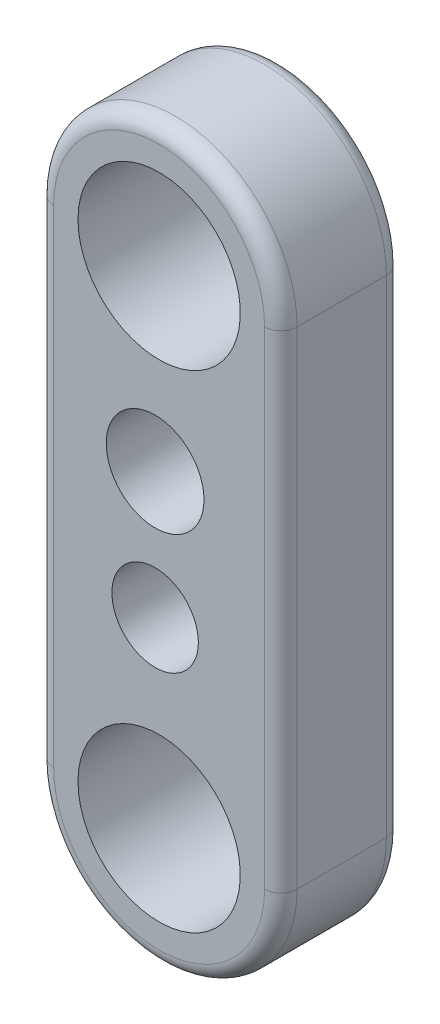
ISO-10303-21;
HEADER;
FILE_DESCRIPTION(('STEP AP214'),'2;1');
FILE_NAME('part.step','',(''),(''),'','','');
FILE_SCHEMA(('AUTOMOTIVE_DESIGN { 1 0 10303 214 1 1 1 1 }'));
ENDSEC;
DATA;
#1=APPLICATION_CONTEXT('core data for automotive mechanical design processes');
#2=APPLICATION_PROTOCOL_DEFINITION('international standard','automotive_design',2000,#1);
#3=PRODUCT_CONTEXT('',#1,'mechanical');
#4=PRODUCT('Part','Part','',(#3));
#5=PRODUCT_RELATED_PRODUCT_CATEGORY('part','',(#4));
#6=PRODUCT_DEFINITION_FORMATION('','',#4);
#7=PRODUCT_DEFINITION_CONTEXT('part definition',#1,'design');
#8=PRODUCT_DEFINITION('design','',#6,#7);
#9=PRODUCT_DEFINITION_SHAPE('','',#8);
#10=(LENGTH_UNIT() NAMED_UNIT(*) SI_UNIT(.MILLI.,.METRE.));
#11=(NAMED_UNIT(*) PLANE_ANGLE_UNIT() SI_UNIT($,.RADIAN.));
#12=(NAMED_UNIT(*) SI_UNIT($,.STERADIAN.) SOLID_ANGLE_UNIT());
#13=UNCERTAINTY_MEASURE_WITH_UNIT(LENGTH_MEASURE(1.E-05),#10,'distance_accuracy_value','');
#14=(GEOMETRIC_REPRESENTATION_CONTEXT(3) GLOBAL_UNCERTAINTY_ASSIGNED_CONTEXT((#13)) GLOBAL_UNIT_ASSIGNED_CONTEXT((#10,
#11,#12)) REPRESENTATION_CONTEXT('',''));
#15=CARTESIAN_POINT('',(0.,0.,0.));
#16=DIRECTION('',(0.,0.,1.));
#17=DIRECTION('',(1.,0.,0.));
#18=AXIS2_PLACEMENT_3D('',#15,#16,#17);
#19=CARTESIAN_POINT('',(-29.739928057554,28.1638489208633,19.05));
#20=DIRECTION('',(1.,0.,0.));
#21=DIRECTION('',(0.,0.,-1.));
#22=AXIS2_PLACEMENT_3D('',#19,#20,#21);
#23=PLANE('',#22);
#24=DIRECTION('',(0.,0.,-1.));
#25=VECTOR('',#24,1.);
#26=CARTESIAN_POINT('',(-29.739928057554,28.1638489208633,19.05));
#27=LINE('',#26,#25);
#28=CARTESIAN_POINT('',(-29.739928057554,28.1638489208633,16.51));
#29=VERTEX_POINT('',#28);
#30=CARTESIAN_POINT('',(-29.739928057554,28.1638489208633,2.54000000000001));
#31=VERTEX_POINT('',#30);
#32=EDGE_CURVE('E217',#29,#31,#27,.T.);
#33=ORIENTED_EDGE('',*,*,#32,.T.);
#34=DIRECTION('',(0.,-1.,0.));
#35=VECTOR('',#34,1.);
#36=CARTESIAN_POINT('',(-29.739928057554,28.1638489208633,2.54));
#37=LINE('',#36,#35);
#38=CARTESIAN_POINT('',(-29.739928057554,-48.0361510791367,2.54000000000001));
#39=VERTEX_POINT('',#38);
#40=EDGE_CURVE('E164',#31,#39,#37,.T.);
#41=ORIENTED_EDGE('',*,*,#40,.T.);
#42=DIRECTION('',(0.,0.,-1.));
#43=VECTOR('',#42,1.);
#44=CARTESIAN_POINT('',(-29.739928057554,-48.0361510791367,19.05));
#45=LINE('',#44,#43);
#46=CARTESIAN_POINT('',(-29.739928057554,-48.0361510791367,16.51));
#47=VERTEX_POINT('',#46);
#48=EDGE_CURVE('E149',#47,#39,#45,.T.);
#49=ORIENTED_EDGE('',*,*,#48,.F.);
#50=DIRECTION('',(0.,-1.,0.));
#51=VECTOR('',#50,1.);
#52=CARTESIAN_POINT('',(-29.739928057554,28.1638489208633,16.51));
#53=LINE('',#52,#51);
#54=EDGE_CURVE('E159',#47,#29,#53,.F.);
#55=ORIENTED_EDGE('',*,*,#54,.T.);
#56=EDGE_LOOP('',(#33,#41,#49,#55));
#57=FACE_BOUND('',#56,.T.);
#58=ADVANCED_FACE('F54',(#57),#23,.F.);
#59=CARTESIAN_POINT('',(-10.689928057554,-48.0361510791367,19.05));
#60=DIRECTION('',(0.,0.,-1.));
#61=DIRECTION('',(-1.,0.,0.));
#62=AXIS2_PLACEMENT_3D('',#59,#60,#61);
#63=CYLINDRICAL_SURFACE('',#62,19.05);
#64=ORIENTED_EDGE('',*,*,#48,.T.);
#65=CARTESIAN_POINT('',(-10.689928057554,-48.0361510791367,2.54));
#66=DIRECTION('',(0.,0.,1.));
#67=DIRECTION('',(1.,0.,0.));
#68=AXIS2_PLACEMENT_3D('',#65,#66,#67);
#69=CIRCLE('',#68,19.05);
#70=CARTESIAN_POINT('',(8.36007194244603,-48.0361510791367,2.54000000000001));
#71=VERTEX_POINT('',#70);
#72=EDGE_CURVE('E12',#39,#71,#69,.T.);
#73=ORIENTED_EDGE('',*,*,#72,.T.);
#74=DIRECTION('',(0.,0.,-1.));
#75=VECTOR('',#74,1.);
#76=CARTESIAN_POINT('',(8.36007194244603,-48.0361510791367,19.05));
#77=LINE('',#76,#75);
#78=CARTESIAN_POINT('',(8.36007194244603,-48.0361510791367,16.51));
#79=VERTEX_POINT('',#78);
#80=EDGE_CURVE('E148',#79,#71,#77,.T.);
#81=ORIENTED_EDGE('',*,*,#80,.F.);
#82=CARTESIAN_POINT('',(-10.689928057554,-48.0361510791367,16.51));
#83=DIRECTION('',(0.,0.,1.));
#84=DIRECTION('',(1.,0.,0.));
#85=AXIS2_PLACEMENT_3D('',#82,#83,#84);
#86=CIRCLE('',#85,19.05);
#87=EDGE_CURVE('E158',#79,#47,#86,.F.);
#88=ORIENTED_EDGE('',*,*,#87,.T.);
#89=EDGE_LOOP('',(#64,#73,#81,#88));
#90=FACE_BOUND('',#89,.T.);
#91=ADVANCED_FACE('F220',(#90),#63,.T.);
#92=CARTESIAN_POINT('',(8.36007194244602,28.1638489208633,19.05));
#93=DIRECTION('',(1.,0.,0.));
#94=DIRECTION('',(0.,1.,0.));
#95=AXIS2_PLACEMENT_3D('',#92,#93,#94);
#96=PLANE('',#95);
#97=ORIENTED_EDGE('',*,*,#80,.T.);
#98=DIRECTION('',(0.,-1.,0.));
#99=VECTOR('',#98,1.);
#100=CARTESIAN_POINT('',(8.36007194244602,28.1638489208633,2.54));
#101=LINE('',#100,#99);
#102=CARTESIAN_POINT('',(8.36007194244602,28.1638489208633,2.54000000000001));
#103=VERTEX_POINT('',#102);
#104=EDGE_CURVE('E61',#71,#103,#101,.F.);
#105=ORIENTED_EDGE('',*,*,#104,.T.);
#106=DIRECTION('',(0.,0.,-1.));
#107=VECTOR('',#106,1.);
#108=CARTESIAN_POINT('',(8.36007194244602,28.1638489208633,19.05));
#109=LINE('',#108,#107);
#110=CARTESIAN_POINT('',(8.36007194244602,28.1638489208633,16.51));
#111=VERTEX_POINT('',#110);
#112=EDGE_CURVE('E228',#111,#103,#109,.T.);
#113=ORIENTED_EDGE('',*,*,#112,.F.);
#114=DIRECTION('',(0.,-1.,0.));
#115=VECTOR('',#114,1.);
#116=CARTESIAN_POINT('',(8.36007194244602,28.1638489208633,16.51));
#117=LINE('',#116,#115);
#118=EDGE_CURVE('E139',#111,#79,#117,.T.);
#119=ORIENTED_EDGE('',*,*,#118,.T.);
#120=EDGE_LOOP('',(#97,#105,#113,#119));
#121=FACE_BOUND('',#120,.T.);
#122=ADVANCED_FACE('F232',(#121),#96,.T.);
#123=CARTESIAN_POINT('',(-10.689928057554,28.1638489208633,19.05));
#124=DIRECTION('',(0.,0.,-1.));
#125=DIRECTION('',(-1.,0.,0.));
#126=AXIS2_PLACEMENT_3D('',#123,#124,#125);
#127=CYLINDRICAL_SURFACE('',#126,19.05);
#128=ORIENTED_EDGE('',*,*,#112,.T.);
#129=CARTESIAN_POINT('',(-10.689928057554,28.1638489208633,2.54));
#130=DIRECTION('',(0.,0.,1.));
#131=DIRECTION('',(1.,0.,0.));
#132=AXIS2_PLACEMENT_3D('',#129,#130,#131);
#133=CIRCLE('',#132,19.05);
#134=EDGE_CURVE('E181',#103,#31,#133,.T.);
#135=ORIENTED_EDGE('',*,*,#134,.T.);
#136=ORIENTED_EDGE('',*,*,#32,.F.);
#137=CARTESIAN_POINT('',(-10.689928057554,28.1638489208633,16.51));
#138=DIRECTION('',(0.,0.,1.));
#139=DIRECTION('',(1.,0.,0.));
#140=AXIS2_PLACEMENT_3D('',#137,#138,#139);
#141=CIRCLE('',#140,19.05);
#142=EDGE_CURVE('E161',#29,#111,#141,.F.);
#143=ORIENTED_EDGE('',*,*,#142,.T.);
#144=EDGE_LOOP('',(#128,#135,#136,#143));
#145=FACE_BOUND('',#144,.T.);
#146=ADVANCED_FACE('F223',(#145),#127,.T.);
#147=CARTESIAN_POINT('',(-10.689928057554,-48.0361510791367,19.05));
#148=DIRECTION('',(0.,0.,1.));
#149=DIRECTION('',(1.,0.,0.));
#150=AXIS2_PLACEMENT_3D('',#147,#148,#149);
#151=PLANE('',#150);
#152=CARTESIAN_POINT('',(-11.3200815684238,0.,19.05));
#153=DIRECTION('',(0.,0.,1.));
#154=DIRECTION('',(1.,0.,0.));
#155=AXIS2_PLACEMENT_3D('',#152,#153,#154);
#156=CIRCLE('',#155,7.65109220633387);
#157=CARTESIAN_POINT('',(-3.66898936208997,0.,19.05));
#158=VERTEX_POINT('',#157);
#159=EDGE_CURVE('E382',#158,#158,#156,.T.);
#160=ORIENTED_EDGE('',*,*,#159,.F.);
#161=EDGE_LOOP('',(#160));
#162=FACE_BOUND('',#161,.T.);
#163=CARTESIAN_POINT('',(-11.3200815684238,-19.7935524277436,19.05));
#164=DIRECTION('',(0.,0.,1.));
#165=DIRECTION('',(1.,0.,0.));
#166=AXIS2_PLACEMENT_3D('',#163,#164,#165);
#167=CIRCLE('',#166,6.76663178055624);
#168=CARTESIAN_POINT('',(-4.55344978786761,-19.7935524277436,19.05));
#169=VERTEX_POINT('',#168);
#170=EDGE_CURVE('E385',#169,#169,#167,.T.);
#171=ORIENTED_EDGE('',*,*,#170,.F.);
#172=EDGE_LOOP('',(#171));
#173=FACE_BOUND('',#172,.T.);
#174=CARTESIAN_POINT('',(-10.689928057554,28.1638489208633,19.05));
#175=DIRECTION('',(0.,0.,1.));
#176=DIRECTION('',(1.,0.,0.));
#177=AXIS2_PLACEMENT_3D('',#174,#175,#176);
#178=CIRCLE('',#177,16.51);
#179=CARTESIAN_POINT('',(5.82007194244602,28.1638489208633,19.05));
#180=VERTEX_POINT('',#179);
#181=CARTESIAN_POINT('',(-27.199928057554,28.1638489208633,19.05));
#182=VERTEX_POINT('',#181);
#183=EDGE_CURVE('E130',#180,#182,#178,.T.);
#184=ORIENTED_EDGE('',*,*,#183,.T.);
#185=DIRECTION('',(0.,-1.,0.));
#186=VECTOR('',#185,1.);
#187=CARTESIAN_POINT('',(-27.199928057554,-48.0361510791367,19.05));
#188=LINE('',#187,#186);
#189=CARTESIAN_POINT('',(-27.199928057554,-48.0361510791367,19.05));
#190=VERTEX_POINT('',#189);
#191=EDGE_CURVE('E153',#182,#190,#188,.T.);
#192=ORIENTED_EDGE('',*,*,#191,.T.);
#193=CARTESIAN_POINT('',(-10.689928057554,-48.0361510791367,19.05));
#194=DIRECTION('',(0.,0.,1.));
#195=DIRECTION('',(1.,0.,0.));
#196=AXIS2_PLACEMENT_3D('',#193,#194,#195);
#197=CIRCLE('',#196,16.51);
#198=CARTESIAN_POINT('',(5.82007194244603,-48.0361510791367,19.05));
#199=VERTEX_POINT('',#198);
#200=EDGE_CURVE('E128',#190,#199,#197,.T.);
#201=ORIENTED_EDGE('',*,*,#200,.T.);
#202=DIRECTION('',(0.,-1.,0.));
#203=VECTOR('',#202,1.);
#204=CARTESIAN_POINT('',(5.82007194244603,-48.0361510791367,19.05));
#205=LINE('',#204,#203);
#206=EDGE_CURVE('E122',#199,#180,#205,.F.);
#207=ORIENTED_EDGE('',*,*,#206,.T.);
#208=EDGE_LOOP('',(#184,#192,#201,#207));
#209=FACE_BOUND('',#208,.T.);
#210=CARTESIAN_POINT('',(-10.689928057554,28.1638489208633,19.05));
#211=DIRECTION('',(0.,0.,-1.));
#212=DIRECTION('',(-1.,0.,0.));
#213=AXIS2_PLACEMENT_3D('',#210,#211,#212);
#214=CIRCLE('',#213,12.7);
#215=CARTESIAN_POINT('',(-23.389928057554,28.1638489208633,19.05));
#216=VERTEX_POINT('',#215);
#217=EDGE_CURVE('E227',#216,#216,#214,.T.);
#218=ORIENTED_EDGE('',*,*,#217,.T.);
#219=EDGE_LOOP('',(#218));
#220=FACE_BOUND('',#219,.T.);
#221=CARTESIAN_POINT('',(-10.689928057554,-48.0361510791367,19.05));
#222=DIRECTION('',(0.,0.,-1.));
#223=DIRECTION('',(-1.,0.,0.));
#224=AXIS2_PLACEMENT_3D('',#221,#222,#223);
#225=CIRCLE('',#224,12.7);
#226=CARTESIAN_POINT('',(-23.389928057554,-48.0361510791367,19.05));
#227=VERTEX_POINT('',#226);
#228=EDGE_CURVE('E145',#227,#227,#225,.T.);
#229=ORIENTED_EDGE('',*,*,#228,.T.);
#230=EDGE_LOOP('',(#229));
#231=FACE_BOUND('',#230,.T.);
#232=ADVANCED_FACE('F124',(#162,#173,#209,#220,#231),#151,.T.);
#233=CARTESIAN_POINT('',(-10.689928057554,-48.0361510791367,0.));
#234=DIRECTION('',(0.,0.,1.));
#235=DIRECTION('',(1.,0.,0.));
#236=AXIS2_PLACEMENT_3D('',#233,#234,#235);
#237=PLANE('',#236);
#238=CARTESIAN_POINT('',(-11.3200815684238,0.,0.));
#239=DIRECTION('',(0.,0.,1.));
#240=DIRECTION('',(1.,0.,0.));
#241=AXIS2_PLACEMENT_3D('',#238,#239,#240);
#242=CIRCLE('',#241,7.65109220633387);
#243=CARTESIAN_POINT('',(-3.66898936208997,0.,0.));
#244=VERTEX_POINT('',#243);
#245=EDGE_CURVE('E190',#244,#244,#242,.T.);
#246=ORIENTED_EDGE('',*,*,#245,.T.);
#247=EDGE_LOOP('',(#246));
#248=FACE_BOUND('',#247,.T.);
#249=CARTESIAN_POINT('',(-11.3200815684238,-19.7935524277436,0.));
#250=DIRECTION('',(0.,0.,1.));
#251=DIRECTION('',(1.,0.,0.));
#252=AXIS2_PLACEMENT_3D('',#249,#250,#251);
#253=CIRCLE('',#252,6.76663178055624);
#254=CARTESIAN_POINT('',(-4.55344978786761,-19.7935524277436,0.));
#255=VERTEX_POINT('',#254);
#256=EDGE_CURVE('E387',#255,#255,#253,.T.);
#257=ORIENTED_EDGE('',*,*,#256,.T.);
#258=EDGE_LOOP('',(#257));
#259=FACE_BOUND('',#258,.T.);
#260=CARTESIAN_POINT('',(-10.689928057554,-48.0361510791367,0.));
#261=DIRECTION('',(0.,0.,1.));
#262=DIRECTION('',(1.,0.,0.));
#263=AXIS2_PLACEMENT_3D('',#260,#261,#262);
#264=CIRCLE('',#263,16.51);
#265=CARTESIAN_POINT('',(5.82007194244603,-48.0361510791367,0.));
#266=VERTEX_POINT('',#265);
#267=CARTESIAN_POINT('',(-27.199928057554,-48.0361510791367,0.));
#268=VERTEX_POINT('',#267);
#269=EDGE_CURVE('E175',#266,#268,#264,.F.);
#270=ORIENTED_EDGE('',*,*,#269,.T.);
#271=DIRECTION('',(0.,-1.,0.));
#272=VECTOR('',#271,1.);
#273=CARTESIAN_POINT('',(-27.199928057554,-48.0361510791367,0.));
#274=LINE('',#273,#272);
#275=CARTESIAN_POINT('',(-27.199928057554,28.1638489208633,0.));
#276=VERTEX_POINT('',#275);
#277=EDGE_CURVE('E178',#268,#276,#274,.F.);
#278=ORIENTED_EDGE('',*,*,#277,.T.);
#279=CARTESIAN_POINT('',(-10.689928057554,28.1638489208633,0.));
#280=DIRECTION('',(0.,0.,1.));
#281=DIRECTION('',(1.,0.,0.));
#282=AXIS2_PLACEMENT_3D('',#279,#280,#281);
#283=CIRCLE('',#282,16.51);
#284=CARTESIAN_POINT('',(5.82007194244602,28.1638489208633,0.));
#285=VERTEX_POINT('',#284);
#286=EDGE_CURVE('E176',#276,#285,#283,.F.);
#287=ORIENTED_EDGE('',*,*,#286,.T.);
#288=DIRECTION('',(0.,-1.,0.));
#289=VECTOR('',#288,1.);
#290=CARTESIAN_POINT('',(5.82007194244603,-48.0361510791367,0.));
#291=LINE('',#290,#289);
#292=EDGE_CURVE('E172',#285,#266,#291,.T.);
#293=ORIENTED_EDGE('',*,*,#292,.T.);
#294=EDGE_LOOP('',(#270,#278,#287,#293));
#295=FACE_BOUND('',#294,.T.);
#296=CARTESIAN_POINT('',(-10.689928057554,28.1638489208633,0.));
#297=DIRECTION('',(0.,0.,-1.));
#298=DIRECTION('',(-1.,0.,0.));
#299=AXIS2_PLACEMENT_3D('',#296,#297,#298);
#300=CIRCLE('',#299,12.7);
#301=CARTESIAN_POINT('',(-23.389928057554,28.1638489208633,0.));
#302=VERTEX_POINT('',#301);
#303=EDGE_CURVE('E233',#302,#302,#300,.T.);
#304=ORIENTED_EDGE('',*,*,#303,.F.);
#305=EDGE_LOOP('',(#304));
#306=FACE_BOUND('',#305,.T.);
#307=CARTESIAN_POINT('',(-10.689928057554,-48.0361510791367,0.));
#308=DIRECTION('',(0.,0.,-1.));
#309=DIRECTION('',(-1.,0.,0.));
#310=AXIS2_PLACEMENT_3D('',#307,#308,#309);
#311=CIRCLE('',#310,12.7);
#312=CARTESIAN_POINT('',(-23.389928057554,-48.0361510791367,0.));
#313=VERTEX_POINT('',#312);
#314=EDGE_CURVE('E395',#313,#313,#311,.T.);
#315=ORIENTED_EDGE('',*,*,#314,.F.);
#316=EDGE_LOOP('',(#315));
#317=FACE_BOUND('',#316,.T.);
#318=ADVANCED_FACE('F203',(#248,#259,#295,#306,#317),#237,.F.);
#319=CARTESIAN_POINT('',(-10.689928057554,-48.0361510791367,19.05));
#320=DIRECTION('',(0.,0.,-1.));
#321=DIRECTION('',(-1.,0.,0.));
#322=AXIS2_PLACEMENT_3D('',#319,#320,#321);
#323=CYLINDRICAL_SURFACE('',#322,12.7);
#324=CARTESIAN_POINT('',(-23.389928057554,-48.0361510791367,19.05));
#325=CARTESIAN_POINT('',(-23.389928057554,-48.0361510791367,18.8515625));
#326=CARTESIAN_POINT('',(-23.389928057554,-48.0361510791367,18.653125));
#327=CARTESIAN_POINT('',(-23.389928057554,-48.0361510791367,18.25625));
#328=CARTESIAN_POINT('',(-23.389928057554,-48.0361510791367,18.0578125));
#329=CARTESIAN_POINT('',(-23.389928057554,-48.0361510791367,17.6609375));
#330=CARTESIAN_POINT('',(-23.389928057554,-48.0361510791367,17.4625));
#331=CARTESIAN_POINT('',(-23.389928057554,-48.0361510791367,17.065625));
#332=CARTESIAN_POINT('',(-23.389928057554,-48.0361510791367,16.8671875));
#333=CARTESIAN_POINT('',(-23.389928057554,-48.0361510791367,16.4703125));
#334=CARTESIAN_POINT('',(-23.389928057554,-48.0361510791367,16.271875));
#335=CARTESIAN_POINT('',(-23.389928057554,-48.0361510791367,15.875));
#336=CARTESIAN_POINT('',(-23.389928057554,-48.0361510791367,15.6765625));
#337=CARTESIAN_POINT('',(-23.389928057554,-48.0361510791367,15.2796875));
#338=CARTESIAN_POINT('',(-23.389928057554,-48.0361510791367,15.08125));
#339=CARTESIAN_POINT('',(-23.389928057554,-48.0361510791367,14.684375));
#340=CARTESIAN_POINT('',(-23.389928057554,-48.0361510791367,14.4859375));
#341=CARTESIAN_POINT('',(-23.389928057554,-48.0361510791367,14.0890625));
#342=CARTESIAN_POINT('',(-23.389928057554,-48.0361510791367,13.890625));
#343=CARTESIAN_POINT('',(-23.389928057554,-48.0361510791367,13.49375));
#344=CARTESIAN_POINT('',(-23.389928057554,-48.0361510791367,13.2953125));
#345=CARTESIAN_POINT('',(-23.389928057554,-48.0361510791367,12.8984375));
#346=CARTESIAN_POINT('',(-23.389928057554,-48.0361510791367,12.7));
#347=CARTESIAN_POINT('',(-23.389928057554,-48.0361510791367,12.303125));
#348=CARTESIAN_POINT('',(-23.389928057554,-48.0361510791367,12.1046875));
#349=CARTESIAN_POINT('',(-23.389928057554,-48.0361510791367,11.7078125));
#350=CARTESIAN_POINT('',(-23.389928057554,-48.0361510791367,11.509375));
#351=CARTESIAN_POINT('',(-23.389928057554,-48.0361510791367,11.1125));
#352=CARTESIAN_POINT('',(-23.389928057554,-48.0361510791367,10.9140625));
#353=CARTESIAN_POINT('',(-23.389928057554,-48.0361510791367,10.5171875));
#354=CARTESIAN_POINT('',(-23.389928057554,-48.0361510791367,10.31875));
#355=CARTESIAN_POINT('',(-23.389928057554,-48.0361510791367,9.921875));
#356=CARTESIAN_POINT('',(-23.389928057554,-48.0361510791367,9.7234375));
#357=CARTESIAN_POINT('',(-23.389928057554,-48.0361510791367,9.3265625));
#358=CARTESIAN_POINT('',(-23.389928057554,-48.0361510791367,9.128125));
#359=CARTESIAN_POINT('',(-23.389928057554,-48.0361510791367,8.73125));
#360=CARTESIAN_POINT('',(-23.389928057554,-48.0361510791367,8.5328125));
#361=CARTESIAN_POINT('',(-23.389928057554,-48.0361510791367,8.1359375));
#362=CARTESIAN_POINT('',(-23.389928057554,-48.0361510791367,7.9375));
#363=CARTESIAN_POINT('',(-23.389928057554,-48.0361510791367,7.540625));
#364=CARTESIAN_POINT('',(-23.389928057554,-48.0361510791367,7.3421875));
#365=CARTESIAN_POINT('',(-23.389928057554,-48.0361510791367,6.9453125));
#366=CARTESIAN_POINT('',(-23.389928057554,-48.0361510791367,6.746875));
#367=CARTESIAN_POINT('',(-23.389928057554,-48.0361510791367,6.35));
#368=CARTESIAN_POINT('',(-23.389928057554,-48.0361510791367,6.1515625));
#369=CARTESIAN_POINT('',(-23.389928057554,-48.0361510791367,5.7546875));
#370=CARTESIAN_POINT('',(-23.389928057554,-48.0361510791367,5.55625));
#371=CARTESIAN_POINT('',(-23.389928057554,-48.0361510791367,5.159375));
#372=CARTESIAN_POINT('',(-23.389928057554,-48.0361510791367,4.9609375));
#373=CARTESIAN_POINT('',(-23.389928057554,-48.0361510791367,4.5640625));
#374=CARTESIAN_POINT('',(-23.389928057554,-48.0361510791367,4.365625));
#375=CARTESIAN_POINT('',(-23.389928057554,-48.0361510791367,3.96875));
#376=CARTESIAN_POINT('',(-23.389928057554,-48.0361510791367,3.7703125));
#377=CARTESIAN_POINT('',(-23.389928057554,-48.0361510791367,3.3734375));
#378=CARTESIAN_POINT('',(-23.389928057554,-48.0361510791367,3.175));
#379=CARTESIAN_POINT('',(-23.389928057554,-48.0361510791367,2.778125));
#380=CARTESIAN_POINT('',(-23.389928057554,-48.0361510791367,2.5796875));
#381=CARTESIAN_POINT('',(-23.389928057554,-48.0361510791367,2.1828125));
#382=CARTESIAN_POINT('',(-23.389928057554,-48.0361510791367,1.984375));
#383=CARTESIAN_POINT('',(-23.389928057554,-48.0361510791367,1.5875));
#384=CARTESIAN_POINT('',(-23.389928057554,-48.0361510791367,1.3890625));
#385=CARTESIAN_POINT('',(-23.389928057554,-48.0361510791367,0.992187500000001));
#386=CARTESIAN_POINT('',(-23.389928057554,-48.0361510791367,0.793750000000001));
#387=CARTESIAN_POINT('',(-23.389928057554,-48.0361510791367,0.396875));
#388=CARTESIAN_POINT('',(-23.389928057554,-48.0361510791367,0.1984375));
#389=CARTESIAN_POINT('',(-23.389928057554,-48.0361510791367,0.));
#390=B_SPLINE_CURVE_WITH_KNOTS('',3,(#324,#325,#326,#327,#328,#329,#330,#331,#332,#333,#334,
#335,#336,#337,#338,#339,#340,#341,#342,#343,#344,#345,#346,#347,#348,#349,#350,#351,#352,#353,
#354,#355,#356,#357,#358,#359,#360,#361,#362,#363,#364,#365,#366,#367,#368,#369,#370,#371,#372,
#373,#374,#375,#376,#377,#378,#379,#380,#381,#382,#383,#384,#385,#386,#387,#388,#389),
.UNSPECIFIED.,.F.,.F.,(4,2,2,2,2,2,2,2,2,2,2,2,2,2,2,2,2,2,2,2,2,2,2,2,2,2,2,2,2,2,2,2,4),(0.,
0.5953125,1.190625,1.7859375,2.38125,2.9765625,3.571875,4.1671875,4.7625,5.3578125,5.953125,
6.5484375,7.14375,7.7390625,8.334375,8.9296875,9.525,10.1203125,10.715625,11.3109375,11.90625,
12.5015625,13.096875,13.6921875,14.2875,14.8828125,15.478125,16.0734375,16.66875,17.2640625,
17.859375,18.4546875,19.05),.UNSPECIFIED.);
#391=EDGE_CURVE('BSEAM300',#227,#313,#390,.T.);
#392=ORIENTED_EDGE('',*,*,#228,.F.);
#393=ORIENTED_EDGE('',*,*,#314,.T.);
#394=ORIENTED_EDGE('',*,*,#391,.T.);
#395=ORIENTED_EDGE('',*,*,#391,.F.);
#396=EDGE_LOOP('',(#392,#394,#393,#395));
#397=FACE_BOUND('',#396,.T.);
#398=ADVANCED_FACE('F300',(#397),#323,.F.);
#399=CARTESIAN_POINT('',(-10.689928057554,28.1638489208633,19.05));
#400=DIRECTION('',(0.,0.,-1.));
#401=DIRECTION('',(-1.,0.,0.));
#402=AXIS2_PLACEMENT_3D('',#399,#400,#401);
#403=CYLINDRICAL_SURFACE('',#402,12.7);
#404=CARTESIAN_POINT('',(-23.389928057554,28.1638489208633,19.05));
#405=CARTESIAN_POINT('',(-23.389928057554,28.1638489208633,18.8515625));
#406=CARTESIAN_POINT('',(-23.389928057554,28.1638489208633,18.653125));
#407=CARTESIAN_POINT('',(-23.389928057554,28.1638489208633,18.25625));
#408=CARTESIAN_POINT('',(-23.389928057554,28.1638489208633,18.0578125));
#409=CARTESIAN_POINT('',(-23.389928057554,28.1638489208633,17.6609375));
#410=CARTESIAN_POINT('',(-23.389928057554,28.1638489208633,17.4625));
#411=CARTESIAN_POINT('',(-23.389928057554,28.1638489208633,17.065625));
#412=CARTESIAN_POINT('',(-23.389928057554,28.1638489208633,16.8671875));
#413=CARTESIAN_POINT('',(-23.389928057554,28.1638489208633,16.4703125));
#414=CARTESIAN_POINT('',(-23.389928057554,28.1638489208633,16.271875));
#415=CARTESIAN_POINT('',(-23.389928057554,28.1638489208633,15.875));
#416=CARTESIAN_POINT('',(-23.389928057554,28.1638489208633,15.6765625));
#417=CARTESIAN_POINT('',(-23.389928057554,28.1638489208633,15.2796875));
#418=CARTESIAN_POINT('',(-23.389928057554,28.1638489208633,15.08125));
#419=CARTESIAN_POINT('',(-23.389928057554,28.1638489208633,14.684375));
#420=CARTESIAN_POINT('',(-23.389928057554,28.1638489208633,14.4859375));
#421=CARTESIAN_POINT('',(-23.389928057554,28.1638489208633,14.0890625));
#422=CARTESIAN_POINT('',(-23.389928057554,28.1638489208633,13.890625));
#423=CARTESIAN_POINT('',(-23.389928057554,28.1638489208633,13.49375));
#424=CARTESIAN_POINT('',(-23.389928057554,28.1638489208633,13.2953125));
#425=CARTESIAN_POINT('',(-23.389928057554,28.1638489208633,12.8984375));
#426=CARTESIAN_POINT('',(-23.389928057554,28.1638489208633,12.7));
#427=CARTESIAN_POINT('',(-23.389928057554,28.1638489208633,12.303125));
#428=CARTESIAN_POINT('',(-23.389928057554,28.1638489208633,12.1046875));
#429=CARTESIAN_POINT('',(-23.389928057554,28.1638489208633,11.7078125));
#430=CARTESIAN_POINT('',(-23.389928057554,28.1638489208633,11.509375));
#431=CARTESIAN_POINT('',(-23.389928057554,28.1638489208633,11.1125));
#432=CARTESIAN_POINT('',(-23.389928057554,28.1638489208633,10.9140625));
#433=CARTESIAN_POINT('',(-23.389928057554,28.1638489208633,10.5171875));
#434=CARTESIAN_POINT('',(-23.389928057554,28.1638489208633,10.31875));
#435=CARTESIAN_POINT('',(-23.389928057554,28.1638489208633,9.921875));
#436=CARTESIAN_POINT('',(-23.389928057554,28.1638489208633,9.7234375));
#437=CARTESIAN_POINT('',(-23.389928057554,28.1638489208633,9.3265625));
#438=CARTESIAN_POINT('',(-23.389928057554,28.1638489208633,9.128125));
#439=CARTESIAN_POINT('',(-23.389928057554,28.1638489208633,8.73125));
#440=CARTESIAN_POINT('',(-23.389928057554,28.1638489208633,8.5328125));
#441=CARTESIAN_POINT('',(-23.389928057554,28.1638489208633,8.1359375));
#442=CARTESIAN_POINT('',(-23.389928057554,28.1638489208633,7.9375));
#443=CARTESIAN_POINT('',(-23.389928057554,28.1638489208633,7.540625));
#444=CARTESIAN_POINT('',(-23.389928057554,28.1638489208633,7.3421875));
#445=CARTESIAN_POINT('',(-23.389928057554,28.1638489208633,6.9453125));
#446=CARTESIAN_POINT('',(-23.389928057554,28.1638489208633,6.746875));
#447=CARTESIAN_POINT('',(-23.389928057554,28.1638489208633,6.35));
#448=CARTESIAN_POINT('',(-23.389928057554,28.1638489208633,6.1515625));
#449=CARTESIAN_POINT('',(-23.389928057554,28.1638489208633,5.7546875));
#450=CARTESIAN_POINT('',(-23.389928057554,28.1638489208633,5.55625));
#451=CARTESIAN_POINT('',(-23.389928057554,28.1638489208633,5.159375));
#452=CARTESIAN_POINT('',(-23.389928057554,28.1638489208633,4.9609375));
#453=CARTESIAN_POINT('',(-23.389928057554,28.1638489208633,4.5640625));
#454=CARTESIAN_POINT('',(-23.389928057554,28.1638489208633,4.365625));
#455=CARTESIAN_POINT('',(-23.389928057554,28.1638489208633,3.96875));
#456=CARTESIAN_POINT('',(-23.389928057554,28.1638489208633,3.7703125));
#457=CARTESIAN_POINT('',(-23.389928057554,28.1638489208633,3.3734375));
#458=CARTESIAN_POINT('',(-23.389928057554,28.1638489208633,3.175));
#459=CARTESIAN_POINT('',(-23.389928057554,28.1638489208633,2.778125));
#460=CARTESIAN_POINT('',(-23.389928057554,28.1638489208633,2.5796875));
#461=CARTESIAN_POINT('',(-23.389928057554,28.1638489208633,2.1828125));
#462=CARTESIAN_POINT('',(-23.389928057554,28.1638489208633,1.984375));
#463=CARTESIAN_POINT('',(-23.389928057554,28.1638489208633,1.5875));
#464=CARTESIAN_POINT('',(-23.389928057554,28.1638489208633,1.3890625));
#465=CARTESIAN_POINT('',(-23.389928057554,28.1638489208633,0.992187500000001));
#466=CARTESIAN_POINT('',(-23.389928057554,28.1638489208633,0.793750000000001));
#467=CARTESIAN_POINT('',(-23.389928057554,28.1638489208633,0.396875));
#468=CARTESIAN_POINT('',(-23.389928057554,28.1638489208633,0.1984375));
#469=CARTESIAN_POINT('',(-23.389928057554,28.1638489208633,0.));
#470=B_SPLINE_CURVE_WITH_KNOTS('',3,(#404,#405,#406,#407,#408,#409,#410,#411,#412,#413,#414,
#415,#416,#417,#418,#419,#420,#421,#422,#423,#424,#425,#426,#427,#428,#429,#430,#431,#432,#433,
#434,#435,#436,#437,#438,#439,#440,#441,#442,#443,#444,#445,#446,#447,#448,#449,#450,#451,#452,
#453,#454,#455,#456,#457,#458,#459,#460,#461,#462,#463,#464,#465,#466,#467,#468,#469),
.UNSPECIFIED.,.F.,.F.,(4,2,2,2,2,2,2,2,2,2,2,2,2,2,2,2,2,2,2,2,2,2,2,2,2,2,2,2,2,2,2,2,4),(0.,
0.5953125,1.190625,1.7859375,2.38125,2.9765625,3.571875,4.1671875,4.7625,5.3578125,5.953125,
6.5484375,7.14375,7.7390625,8.334375,8.9296875,9.525,10.1203125,10.715625,11.3109375,11.90625,
12.5015625,13.096875,13.6921875,14.2875,14.8828125,15.478125,16.0734375,16.66875,17.2640625,
17.859375,18.4546875,19.05),.UNSPECIFIED.);
#471=EDGE_CURVE('BSEAM260',#216,#302,#470,.T.);
#472=ORIENTED_EDGE('',*,*,#217,.F.);
#473=ORIENTED_EDGE('',*,*,#303,.T.);
#474=ORIENTED_EDGE('',*,*,#471,.T.);
#475=ORIENTED_EDGE('',*,*,#471,.F.);
#476=EDGE_LOOP('',(#472,#474,#473,#475));
#477=FACE_BOUND('',#476,.T.);
#478=ADVANCED_FACE('F260',(#477),#403,.F.);
#479=CARTESIAN_POINT('',(5.82007194244602,28.1638489208633,16.51));
#480=DIRECTION('',(0.,-1.,0.));
#481=DIRECTION('',(1.,0.,0.));
#482=AXIS2_PLACEMENT_3D('',#479,#480,#481);
#483=CYLINDRICAL_SURFACE('',#482,2.54);
#484=CARTESIAN_POINT('',(5.82007194244603,-48.0361510791367,16.51));
#485=DIRECTION('',(0.,-1.,0.));
#486=DIRECTION('',(0.,0.,-1.));
#487=AXIS2_PLACEMENT_3D('',#484,#485,#486);
#488=CIRCLE('',#487,2.54);
#489=EDGE_CURVE('E141',#79,#199,#488,.T.);
#490=ORIENTED_EDGE('',*,*,#489,.F.);
#491=ORIENTED_EDGE('',*,*,#118,.F.);
#492=CARTESIAN_POINT('',(5.82007194244602,28.1638489208633,16.51));
#493=DIRECTION('',(0.,1.,0.));
#494=DIRECTION('',(0.,0.,1.));
#495=AXIS2_PLACEMENT_3D('',#492,#493,#494);
#496=CIRCLE('',#495,2.54);
#497=EDGE_CURVE('E140',#180,#111,#496,.T.);
#498=ORIENTED_EDGE('',*,*,#497,.F.);
#499=ORIENTED_EDGE('',*,*,#206,.F.);
#500=EDGE_LOOP('',(#490,#491,#498,#499));
#501=FACE_BOUND('',#500,.T.);
#502=ADVANCED_FACE('F138',(#501),#483,.T.);
#503=CARTESIAN_POINT('',(-10.689928057554,28.1638489208633,16.51));
#504=DIRECTION('',(0.,0.,1.));
#505=DIRECTION('',(1.,0.,0.));
#506=AXIS2_PLACEMENT_3D('',#503,#504,#505);
#507=TOROIDAL_SURFACE('',#506,16.51,2.54);
#508=ORIENTED_EDGE('',*,*,#497,.T.);
#509=ORIENTED_EDGE('',*,*,#142,.F.);
#510=CARTESIAN_POINT('',(-27.199928057554,28.1638489208633,16.51));
#511=DIRECTION('',(0.,-1.,0.));
#512=DIRECTION('',(0.,0.,-1.));
#513=AXIS2_PLACEMENT_3D('',#510,#511,#512);
#514=CIRCLE('',#513,2.54);
#515=EDGE_CURVE('E147',#182,#29,#514,.T.);
#516=ORIENTED_EDGE('',*,*,#515,.F.);
#517=ORIENTED_EDGE('',*,*,#183,.F.);
#518=EDGE_LOOP('',(#508,#509,#516,#517));
#519=FACE_BOUND('',#518,.T.);
#520=ADVANCED_FACE('F143',(#519),#507,.T.);
#521=CARTESIAN_POINT('',(-10.689928057554,-48.0361510791367,16.51));
#522=DIRECTION('',(0.,0.,1.));
#523=DIRECTION('',(1.,0.,0.));
#524=AXIS2_PLACEMENT_3D('',#521,#522,#523);
#525=TOROIDAL_SURFACE('',#524,16.51,2.54);
#526=ORIENTED_EDGE('',*,*,#489,.T.);
#527=ORIENTED_EDGE('',*,*,#200,.F.);
#528=CARTESIAN_POINT('',(-27.199928057554,-48.0361510791367,16.51));
#529=DIRECTION('',(0.,1.,0.));
#530=DIRECTION('',(0.,0.,1.));
#531=AXIS2_PLACEMENT_3D('',#528,#529,#530);
#532=CIRCLE('',#531,2.54);
#533=EDGE_CURVE('E168',#47,#190,#532,.T.);
#534=ORIENTED_EDGE('',*,*,#533,.F.);
#535=ORIENTED_EDGE('',*,*,#87,.F.);
#536=EDGE_LOOP('',(#526,#527,#534,#535));
#537=FACE_BOUND('',#536,.T.);
#538=ADVANCED_FACE('F222',(#537),#525,.T.);
#539=CARTESIAN_POINT('',(-27.199928057554,-48.0361510791367,16.51));
#540=DIRECTION('',(0.,1.,0.));
#541=DIRECTION('',(0.,0.,1.));
#542=AXIS2_PLACEMENT_3D('',#539,#540,#541);
#543=CYLINDRICAL_SURFACE('',#542,2.54);
#544=ORIENTED_EDGE('',*,*,#515,.T.);
#545=ORIENTED_EDGE('',*,*,#54,.F.);
#546=ORIENTED_EDGE('',*,*,#533,.T.);
#547=ORIENTED_EDGE('',*,*,#191,.F.);
#548=EDGE_LOOP('',(#544,#545,#546,#547));
#549=FACE_BOUND('',#548,.T.);
#550=ADVANCED_FACE('F225',(#549),#543,.T.);
#551=CARTESIAN_POINT('',(5.82007194244603,-48.0361510791367,2.54));
#552=DIRECTION('',(0.,1.,0.));
#553=DIRECTION('',(-1.,0.,0.));
#554=AXIS2_PLACEMENT_3D('',#551,#552,#553);
#555=CYLINDRICAL_SURFACE('',#554,2.54);
#556=CARTESIAN_POINT('',(5.82007194244603,-48.0361510791367,2.54));
#557=DIRECTION('',(0.,-1.,0.));
#558=DIRECTION('',(0.,0.,-1.));
#559=AXIS2_PLACEMENT_3D('',#556,#557,#558);
#560=CIRCLE('',#559,2.54);
#561=EDGE_CURVE('E189',#266,#71,#560,.T.);
#562=ORIENTED_EDGE('',*,*,#561,.F.);
#563=ORIENTED_EDGE('',*,*,#292,.F.);
#564=CARTESIAN_POINT('',(5.82007194244602,28.1638489208633,2.54));
#565=DIRECTION('',(0.,1.,0.));
#566=DIRECTION('',(0.,0.,1.));
#567=AXIS2_PLACEMENT_3D('',#564,#565,#566);
#568=CIRCLE('',#567,2.54);
#569=EDGE_CURVE('E56',#103,#285,#568,.T.);
#570=ORIENTED_EDGE('',*,*,#569,.F.);
#571=ORIENTED_EDGE('',*,*,#104,.F.);
#572=EDGE_LOOP('',(#562,#563,#570,#571));
#573=FACE_BOUND('',#572,.T.);
#574=ADVANCED_FACE('F60',(#573),#555,.T.);
#575=CARTESIAN_POINT('',(-10.689928057554,28.1638489208633,2.54));
#576=DIRECTION('',(0.,0.,1.));
#577=DIRECTION('',(1.,0.,0.));
#578=AXIS2_PLACEMENT_3D('',#575,#576,#577);
#579=TOROIDAL_SURFACE('',#578,16.51,2.54);
#580=ORIENTED_EDGE('',*,*,#569,.T.);
#581=ORIENTED_EDGE('',*,*,#286,.F.);
#582=CARTESIAN_POINT('',(-27.199928057554,28.1638489208633,2.54));
#583=DIRECTION('',(0.,-1.,0.));
#584=DIRECTION('',(0.,0.,-1.));
#585=AXIS2_PLACEMENT_3D('',#582,#583,#584);
#586=CIRCLE('',#585,2.54);
#587=EDGE_CURVE('E187',#31,#276,#586,.T.);
#588=ORIENTED_EDGE('',*,*,#587,.F.);
#589=ORIENTED_EDGE('',*,*,#134,.F.);
#590=EDGE_LOOP('',(#580,#581,#588,#589));
#591=FACE_BOUND('',#590,.T.);
#592=ADVANCED_FACE('F199',(#591),#579,.T.);
#593=CARTESIAN_POINT('',(-10.689928057554,-48.0361510791367,2.54));
#594=DIRECTION('',(0.,0.,1.));
#595=DIRECTION('',(1.,0.,0.));
#596=AXIS2_PLACEMENT_3D('',#593,#594,#595);
#597=TOROIDAL_SURFACE('',#596,16.51,2.54);
#598=ORIENTED_EDGE('',*,*,#561,.T.);
#599=ORIENTED_EDGE('',*,*,#72,.F.);
#600=CARTESIAN_POINT('',(-27.199928057554,-48.0361510791367,2.54));
#601=DIRECTION('',(0.,1.,0.));
#602=DIRECTION('',(0.,0.,1.));
#603=AXIS2_PLACEMENT_3D('',#600,#601,#602);
#604=CIRCLE('',#603,2.54);
#605=EDGE_CURVE('E183',#268,#39,#604,.T.);
#606=ORIENTED_EDGE('',*,*,#605,.F.);
#607=ORIENTED_EDGE('',*,*,#269,.F.);
#608=EDGE_LOOP('',(#598,#599,#606,#607));
#609=FACE_BOUND('',#608,.T.);
#610=ADVANCED_FACE('F208',(#609),#597,.T.);
#611=CARTESIAN_POINT('',(-27.199928057554,28.1638489208633,2.54));
#612=DIRECTION('',(0.,-1.,0.));
#613=DIRECTION('',(0.,0.,-1.));
#614=AXIS2_PLACEMENT_3D('',#611,#612,#613);
#615=CYLINDRICAL_SURFACE('',#614,2.54);
#616=ORIENTED_EDGE('',*,*,#587,.T.);
#617=ORIENTED_EDGE('',*,*,#277,.F.);
#618=ORIENTED_EDGE('',*,*,#605,.T.);
#619=ORIENTED_EDGE('',*,*,#40,.F.);
#620=EDGE_LOOP('',(#616,#617,#618,#619));
#621=FACE_BOUND('',#620,.T.);
#622=ADVANCED_FACE('F206',(#621),#615,.T.);
#623=CARTESIAN_POINT('',(-11.3200815684238,-19.7935524277436,0.));
#624=DIRECTION('',(0.,0.,1.));
#625=DIRECTION('',(1.,0.,0.));
#626=AXIS2_PLACEMENT_3D('',#623,#624,#625);
#627=CYLINDRICAL_SURFACE('',#626,6.76663178055624);
#628=CARTESIAN_POINT('',(-4.55344978786761,-19.7935524277436,0.));
#629=CARTESIAN_POINT('',(-4.55344978786761,-19.7935524277436,0.1984375));
#630=CARTESIAN_POINT('',(-4.55344978786761,-19.7935524277436,0.396875));
#631=CARTESIAN_POINT('',(-4.55344978786761,-19.7935524277436,0.79375));
#632=CARTESIAN_POINT('',(-4.55344978786761,-19.7935524277436,0.9921875));
#633=CARTESIAN_POINT('',(-4.55344978786761,-19.7935524277436,1.3890625));
#634=CARTESIAN_POINT('',(-4.55344978786761,-19.7935524277436,1.5875));
#635=CARTESIAN_POINT('',(-4.55344978786761,-19.7935524277436,1.984375));
#636=CARTESIAN_POINT('',(-4.55344978786761,-19.7935524277436,2.1828125));
#637=CARTESIAN_POINT('',(-4.55344978786761,-19.7935524277436,2.5796875));
#638=CARTESIAN_POINT('',(-4.55344978786761,-19.7935524277436,2.778125));
#639=CARTESIAN_POINT('',(-4.55344978786761,-19.7935524277436,3.175));
#640=CARTESIAN_POINT('',(-4.55344978786761,-19.7935524277436,3.3734375));
#641=CARTESIAN_POINT('',(-4.55344978786761,-19.7935524277436,3.7703125));
#642=CARTESIAN_POINT('',(-4.55344978786761,-19.7935524277436,3.96875));
#643=CARTESIAN_POINT('',(-4.55344978786761,-19.7935524277436,4.365625));
#644=CARTESIAN_POINT('',(-4.55344978786761,-19.7935524277436,4.5640625));
#645=CARTESIAN_POINT('',(-4.55344978786761,-19.7935524277436,4.9609375));
#646=CARTESIAN_POINT('',(-4.55344978786761,-19.7935524277436,5.159375));
#647=CARTESIAN_POINT('',(-4.55344978786761,-19.7935524277436,5.55625));
#648=CARTESIAN_POINT('',(-4.55344978786761,-19.7935524277436,5.7546875));
#649=CARTESIAN_POINT('',(-4.55344978786761,-19.7935524277436,6.1515625));
#650=CARTESIAN_POINT('',(-4.55344978786761,-19.7935524277436,6.35));
#651=CARTESIAN_POINT('',(-4.55344978786761,-19.7935524277436,6.746875));
#652=CARTESIAN_POINT('',(-4.55344978786761,-19.7935524277436,6.9453125));
#653=CARTESIAN_POINT('',(-4.55344978786761,-19.7935524277436,7.3421875));
#654=CARTESIAN_POINT('',(-4.55344978786761,-19.7935524277436,7.540625));
#655=CARTESIAN_POINT('',(-4.55344978786761,-19.7935524277436,7.9375));
#656=CARTESIAN_POINT('',(-4.55344978786761,-19.7935524277436,8.1359375));
#657=CARTESIAN_POINT('',(-4.55344978786761,-19.7935524277436,8.5328125));
#658=CARTESIAN_POINT('',(-4.55344978786761,-19.7935524277436,8.73125));
#659=CARTESIAN_POINT('',(-4.55344978786761,-19.7935524277436,9.128125));
#660=CARTESIAN_POINT('',(-4.55344978786761,-19.7935524277436,9.3265625));
#661=CARTESIAN_POINT('',(-4.55344978786761,-19.7935524277436,9.7234375));
#662=CARTESIAN_POINT('',(-4.55344978786761,-19.7935524277436,9.921875));
#663=CARTESIAN_POINT('',(-4.55344978786761,-19.7935524277436,10.31875));
#664=CARTESIAN_POINT('',(-4.55344978786761,-19.7935524277436,10.5171875));
#665=CARTESIAN_POINT('',(-4.55344978786761,-19.7935524277436,10.9140625));
#666=CARTESIAN_POINT('',(-4.55344978786761,-19.7935524277436,11.1125));
#667=CARTESIAN_POINT('',(-4.55344978786761,-19.7935524277436,11.509375));
#668=CARTESIAN_POINT('',(-4.55344978786761,-19.7935524277436,11.7078125));
#669=CARTESIAN_POINT('',(-4.55344978786761,-19.7935524277436,12.1046875));
#670=CARTESIAN_POINT('',(-4.55344978786761,-19.7935524277436,12.303125));
#671=CARTESIAN_POINT('',(-4.55344978786761,-19.7935524277436,12.7));
#672=CARTESIAN_POINT('',(-4.55344978786761,-19.7935524277436,12.8984375));
#673=CARTESIAN_POINT('',(-4.55344978786761,-19.7935524277436,13.2953125));
#674=CARTESIAN_POINT('',(-4.55344978786761,-19.7935524277436,13.49375));
#675=CARTESIAN_POINT('',(-4.55344978786761,-19.7935524277436,13.890625));
#676=CARTESIAN_POINT('',(-4.55344978786761,-19.7935524277436,14.0890625));
#677=CARTESIAN_POINT('',(-4.55344978786761,-19.7935524277436,14.4859375));
#678=CARTESIAN_POINT('',(-4.55344978786761,-19.7935524277436,14.684375));
#679=CARTESIAN_POINT('',(-4.55344978786761,-19.7935524277436,15.08125));
#680=CARTESIAN_POINT('',(-4.55344978786761,-19.7935524277436,15.2796875));
#681=CARTESIAN_POINT('',(-4.55344978786761,-19.7935524277436,15.6765625));
#682=CARTESIAN_POINT('',(-4.55344978786761,-19.7935524277436,15.875));
#683=CARTESIAN_POINT('',(-4.55344978786761,-19.7935524277436,16.271875));
#684=CARTESIAN_POINT('',(-4.55344978786761,-19.7935524277436,16.4703125));
#685=CARTESIAN_POINT('',(-4.55344978786761,-19.7935524277436,16.8671875));
#686=CARTESIAN_POINT('',(-4.55344978786761,-19.7935524277436,17.065625));
#687=CARTESIAN_POINT('',(-4.55344978786761,-19.7935524277436,17.4625));
#688=CARTESIAN_POINT('',(-4.55344978786761,-19.7935524277436,17.6609375));
#689=CARTESIAN_POINT('',(-4.55344978786761,-19.7935524277436,18.0578125));
#690=CARTESIAN_POINT('',(-4.55344978786761,-19.7935524277436,18.25625));
#691=CARTESIAN_POINT('',(-4.55344978786761,-19.7935524277436,18.653125));
#692=CARTESIAN_POINT('',(-4.55344978786761,-19.7935524277436,18.8515625));
#693=CARTESIAN_POINT('',(-4.55344978786761,-19.7935524277436,19.05));
#694=B_SPLINE_CURVE_WITH_KNOTS('',3,(#628,#629,#630,#631,#632,#633,#634,#635,#636,#637,#638,
#639,#640,#641,#642,#643,#644,#645,#646,#647,#648,#649,#650,#651,#652,#653,#654,#655,#656,#657,
#658,#659,#660,#661,#662,#663,#664,#665,#666,#667,#668,#669,#670,#671,#672,#673,#674,#675,#676,
#677,#678,#679,#680,#681,#682,#683,#684,#685,#686,#687,#688,#689,#690,#691,#692,#693),
.UNSPECIFIED.,.F.,.F.,(4,2,2,2,2,2,2,2,2,2,2,2,2,2,2,2,2,2,2,2,2,2,2,2,2,2,2,2,2,2,2,2,4),(0.,
0.5953125,1.190625,1.7859375,2.38125,2.9765625,3.571875,4.1671875,4.7625,5.3578125,5.953125,
6.5484375,7.14375,7.7390625,8.334375,8.9296875,9.525,10.1203125,10.715625,11.3109375,11.90625,
12.5015625,13.096875,13.6921875,14.2875,14.8828125,15.478125,16.0734375,16.66875,17.2640625,
17.859375,18.4546875,19.05),.UNSPECIFIED.);
#695=EDGE_CURVE('BSEAM258',#255,#169,#694,.T.);
#696=ORIENTED_EDGE('',*,*,#256,.F.);
#697=ORIENTED_EDGE('',*,*,#170,.T.);
#698=ORIENTED_EDGE('',*,*,#695,.T.);
#699=ORIENTED_EDGE('',*,*,#695,.F.);
#700=EDGE_LOOP('',(#696,#698,#697,#699));
#701=FACE_BOUND('',#700,.T.);
#702=ADVANCED_FACE('F258',(#701),#627,.F.);
#703=CARTESIAN_POINT('',(-11.3200815684238,0.,0.));
#704=DIRECTION('',(0.,0.,1.));
#705=DIRECTION('',(1.,0.,0.));
#706=AXIS2_PLACEMENT_3D('',#703,#704,#705);
#707=CYLINDRICAL_SURFACE('',#706,7.65109220633387);
#708=CARTESIAN_POINT('',(-3.66898936208997,0.,0.));
#709=CARTESIAN_POINT('',(-3.66898936208997,0.,0.1984375));
#710=CARTESIAN_POINT('',(-3.66898936208997,0.,0.396875));
#711=CARTESIAN_POINT('',(-3.66898936208997,0.,0.79375));
#712=CARTESIAN_POINT('',(-3.66898936208997,0.,0.9921875));
#713=CARTESIAN_POINT('',(-3.66898936208997,0.,1.3890625));
#714=CARTESIAN_POINT('',(-3.66898936208997,0.,1.5875));
#715=CARTESIAN_POINT('',(-3.66898936208997,0.,1.984375));
#716=CARTESIAN_POINT('',(-3.66898936208997,0.,2.1828125));
#717=CARTESIAN_POINT('',(-3.66898936208997,0.,2.5796875));
#718=CARTESIAN_POINT('',(-3.66898936208997,0.,2.778125));
#719=CARTESIAN_POINT('',(-3.66898936208997,0.,3.175));
#720=CARTESIAN_POINT('',(-3.66898936208997,0.,3.3734375));
#721=CARTESIAN_POINT('',(-3.66898936208997,0.,3.7703125));
#722=CARTESIAN_POINT('',(-3.66898936208997,0.,3.96875));
#723=CARTESIAN_POINT('',(-3.66898936208997,0.,4.365625));
#724=CARTESIAN_POINT('',(-3.66898936208997,0.,4.5640625));
#725=CARTESIAN_POINT('',(-3.66898936208997,0.,4.9609375));
#726=CARTESIAN_POINT('',(-3.66898936208997,0.,5.159375));
#727=CARTESIAN_POINT('',(-3.66898936208997,0.,5.55625));
#728=CARTESIAN_POINT('',(-3.66898936208997,0.,5.7546875));
#729=CARTESIAN_POINT('',(-3.66898936208997,0.,6.1515625));
#730=CARTESIAN_POINT('',(-3.66898936208997,0.,6.35));
#731=CARTESIAN_POINT('',(-3.66898936208997,0.,6.746875));
#732=CARTESIAN_POINT('',(-3.66898936208997,0.,6.9453125));
#733=CARTESIAN_POINT('',(-3.66898936208997,0.,7.3421875));
#734=CARTESIAN_POINT('',(-3.66898936208997,0.,7.540625));
#735=CARTESIAN_POINT('',(-3.66898936208997,0.,7.9375));
#736=CARTESIAN_POINT('',(-3.66898936208997,0.,8.1359375));
#737=CARTESIAN_POINT('',(-3.66898936208997,0.,8.5328125));
#738=CARTESIAN_POINT('',(-3.66898936208997,0.,8.73125));
#739=CARTESIAN_POINT('',(-3.66898936208997,0.,9.128125));
#740=CARTESIAN_POINT('',(-3.66898936208997,0.,9.3265625));
#741=CARTESIAN_POINT('',(-3.66898936208997,0.,9.7234375));
#742=CARTESIAN_POINT('',(-3.66898936208997,0.,9.921875));
#743=CARTESIAN_POINT('',(-3.66898936208997,0.,10.31875));
#744=CARTESIAN_POINT('',(-3.66898936208997,0.,10.5171875));
#745=CARTESIAN_POINT('',(-3.66898936208997,0.,10.9140625));
#746=CARTESIAN_POINT('',(-3.66898936208997,0.,11.1125));
#747=CARTESIAN_POINT('',(-3.66898936208997,0.,11.509375));
#748=CARTESIAN_POINT('',(-3.66898936208997,0.,11.7078125));
#749=CARTESIAN_POINT('',(-3.66898936208997,0.,12.1046875));
#750=CARTESIAN_POINT('',(-3.66898936208997,0.,12.303125));
#751=CARTESIAN_POINT('',(-3.66898936208997,0.,12.7));
#752=CARTESIAN_POINT('',(-3.66898936208997,0.,12.8984375));
#753=CARTESIAN_POINT('',(-3.66898936208997,0.,13.2953125));
#754=CARTESIAN_POINT('',(-3.66898936208997,0.,13.49375));
#755=CARTESIAN_POINT('',(-3.66898936208997,0.,13.890625));
#756=CARTESIAN_POINT('',(-3.66898936208997,0.,14.0890625));
#757=CARTESIAN_POINT('',(-3.66898936208997,0.,14.4859375));
#758=CARTESIAN_POINT('',(-3.66898936208997,0.,14.684375));
#759=CARTESIAN_POINT('',(-3.66898936208997,0.,15.08125));
#760=CARTESIAN_POINT('',(-3.66898936208997,0.,15.2796875));
#761=CARTESIAN_POINT('',(-3.66898936208997,0.,15.6765625));
#762=CARTESIAN_POINT('',(-3.66898936208997,0.,15.875));
#763=CARTESIAN_POINT('',(-3.66898936208997,0.,16.271875));
#764=CARTESIAN_POINT('',(-3.66898936208997,0.,16.4703125));
#765=CARTESIAN_POINT('',(-3.66898936208997,0.,16.8671875));
#766=CARTESIAN_POINT('',(-3.66898936208997,0.,17.065625));
#767=CARTESIAN_POINT('',(-3.66898936208997,0.,17.4625));
#768=CARTESIAN_POINT('',(-3.66898936208997,0.,17.6609375));
#769=CARTESIAN_POINT('',(-3.66898936208997,0.,18.0578125));
#770=CARTESIAN_POINT('',(-3.66898936208997,0.,18.25625));
#771=CARTESIAN_POINT('',(-3.66898936208997,0.,18.653125));
#772=CARTESIAN_POINT('',(-3.66898936208997,0.,18.8515625));
#773=CARTESIAN_POINT('',(-3.66898936208997,0.,19.05));
#774=B_SPLINE_CURVE_WITH_KNOTS('',3,(#708,#709,#710,#711,#712,#713,#714,#715,#716,#717,#718,
#719,#720,#721,#722,#723,#724,#725,#726,#727,#728,#729,#730,#731,#732,#733,#734,#735,#736,#737,
#738,#739,#740,#741,#742,#743,#744,#745,#746,#747,#748,#749,#750,#751,#752,#753,#754,#755,#756,
#757,#758,#759,#760,#761,#762,#763,#764,#765,#766,#767,#768,#769,#770,#771,#772,#773),
.UNSPECIFIED.,.F.,.F.,(4,2,2,2,2,2,2,2,2,2,2,2,2,2,2,2,2,2,2,2,2,2,2,2,2,2,2,2,2,2,2,2,4),(0.,
0.5953125,1.190625,1.7859375,2.38125,2.9765625,3.571875,4.1671875,4.7625,5.3578125,5.953125,
6.5484375,7.14375,7.7390625,8.334375,8.9296875,9.525,10.1203125,10.715625,11.3109375,11.90625,
12.5015625,13.096875,13.6921875,14.2875,14.8828125,15.478125,16.0734375,16.66875,17.2640625,
17.859375,18.4546875,19.05),.UNSPECIFIED.);
#775=EDGE_CURVE('BSEAM365',#244,#158,#774,.T.);
#776=ORIENTED_EDGE('',*,*,#245,.F.);
#777=ORIENTED_EDGE('',*,*,#159,.T.);
#778=ORIENTED_EDGE('',*,*,#775,.T.);
#779=ORIENTED_EDGE('',*,*,#775,.F.);
#780=EDGE_LOOP('',(#776,#778,#777,#779));
#781=FACE_BOUND('',#780,.T.);
#782=ADVANCED_FACE('F365',(#781),#707,.F.);
#783=CLOSED_SHELL('',(#58,#91,#122,#146,#232,#318,#398,#478,#502,#520,#538,#550,#574,#592,#610,
#622,#702,#782));
#784=MANIFOLD_SOLID_BREP('B2',#783);
#785=ADVANCED_BREP_SHAPE_REPRESENTATION('',(#18,#784),#14);
#786=SHAPE_DEFINITION_REPRESENTATION(#9,#785);
ENDSEC;
END-ISO-10303-21;
